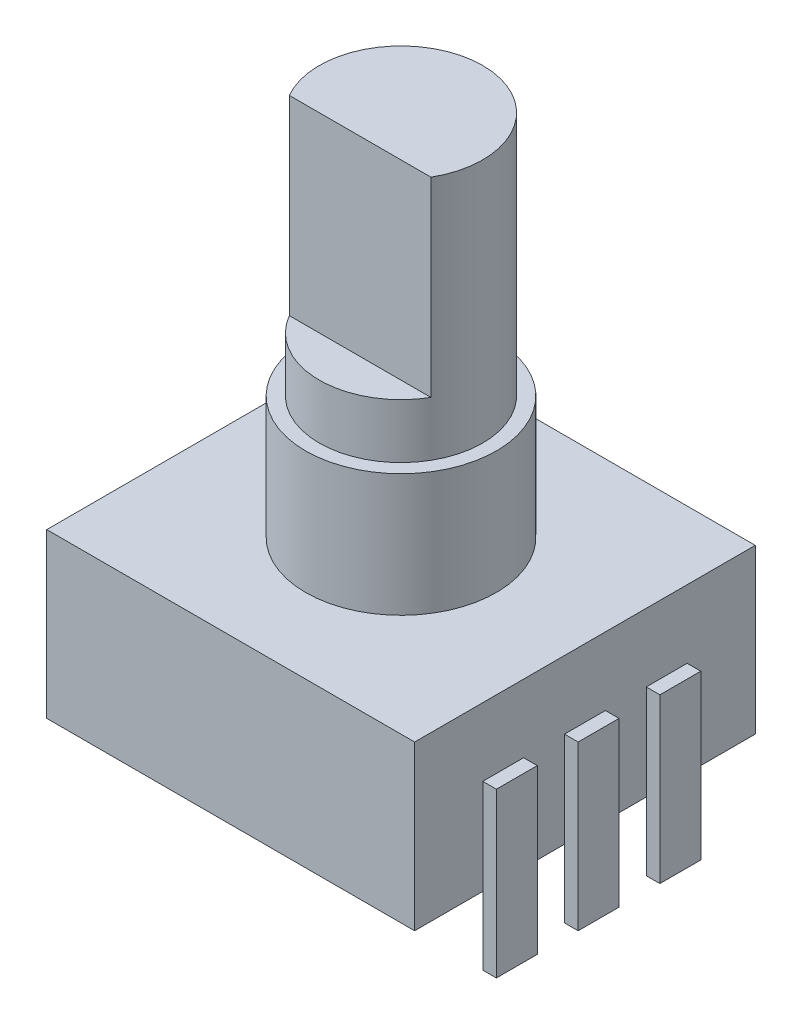
ISO-10303-21;
HEADER;
FILE_DESCRIPTION(('STEP AP214'),'2;1');
FILE_NAME('part.step','',(''),(''),'','','');
FILE_SCHEMA(('AUTOMOTIVE_DESIGN { 1 0 10303 214 1 1 1 1 }'));
ENDSEC;
DATA;
#1=APPLICATION_CONTEXT('core data for automotive mechanical design processes');
#2=APPLICATION_PROTOCOL_DEFINITION('international standard','automotive_design',2000,#1);
#3=PRODUCT_CONTEXT('',#1,'mechanical');
#4=PRODUCT('Part','Part','',(#3));
#5=PRODUCT_RELATED_PRODUCT_CATEGORY('part','',(#4));
#6=PRODUCT_DEFINITION_FORMATION('','',#4);
#7=PRODUCT_DEFINITION_CONTEXT('part definition',#1,'design');
#8=PRODUCT_DEFINITION('design','',#6,#7);
#9=PRODUCT_DEFINITION_SHAPE('','',#8);
#10=(LENGTH_UNIT() NAMED_UNIT(*) SI_UNIT(.MILLI.,.METRE.));
#11=(NAMED_UNIT(*) PLANE_ANGLE_UNIT() SI_UNIT($,.RADIAN.));
#12=(NAMED_UNIT(*) SI_UNIT($,.STERADIAN.) SOLID_ANGLE_UNIT());
#13=UNCERTAINTY_MEASURE_WITH_UNIT(LENGTH_MEASURE(1.E-05),#10,'distance_accuracy_value','');
#14=(GEOMETRIC_REPRESENTATION_CONTEXT(3) GLOBAL_UNCERTAINTY_ASSIGNED_CONTEXT((#13)) GLOBAL_UNIT_ASSIGNED_CONTEXT((#10,
#11,#12)) REPRESENTATION_CONTEXT('',''));
#15=CARTESIAN_POINT('',(0.,0.,0.));
#16=DIRECTION('',(0.,0.,1.));
#17=DIRECTION('',(1.,0.,0.));
#18=AXIS2_PLACEMENT_3D('',#15,#16,#17);
#19=CARTESIAN_POINT('',(6.75,-6.,0.));
#20=DIRECTION('',(-1.,0.,0.));
#21=DIRECTION('',(0.,0.,1.));
#22=AXIS2_PLACEMENT_3D('',#19,#20,#21);
#23=PLANE('',#22);
#24=DIRECTION('',(0.,0.,1.));
#25=VECTOR('',#24,1.);
#26=CARTESIAN_POINT('',(6.75,-2.5,2.25));
#27=LINE('',#26,#25);
#28=CARTESIAN_POINT('',(6.75,-2.5,2.25));
#29=VERTEX_POINT('',#28);
#30=CARTESIAN_POINT('',(6.75,-2.5,3.75));
#31=VERTEX_POINT('',#30);
#32=EDGE_CURVE('E304',#29,#31,#27,.T.);
#33=ORIENTED_EDGE('',*,*,#32,.F.);
#34=DIRECTION('',(0.,1.,0.));
#35=VECTOR('',#34,1.);
#36=CARTESIAN_POINT('',(6.75,-8.5,2.25));
#37=LINE('',#36,#35);
#38=CARTESIAN_POINT('',(6.75,-6.,2.25));
#39=VERTEX_POINT('',#38);
#40=EDGE_CURVE('E339',#39,#29,#37,.T.);
#41=ORIENTED_EDGE('',*,*,#40,.F.);
#42=DIRECTION('',(0.,0.,1.));
#43=VECTOR('',#42,1.);
#44=CARTESIAN_POINT('',(6.75,-6.,0.));
#45=LINE('',#44,#43);
#46=CARTESIAN_POINT('',(6.75,-6.,0.75));
#47=VERTEX_POINT('',#46);
#48=EDGE_CURVE('E480',#47,#39,#45,.T.);
#49=ORIENTED_EDGE('',*,*,#48,.F.);
#50=DIRECTION('',(0.,1.,0.));
#51=VECTOR('',#50,1.);
#52=CARTESIAN_POINT('',(6.75,-8.5,0.75));
#53=LINE('',#52,#51);
#54=CARTESIAN_POINT('',(6.75,-2.5,0.75));
#55=VERTEX_POINT('',#54);
#56=EDGE_CURVE('E359',#47,#55,#53,.T.);
#57=ORIENTED_EDGE('',*,*,#56,.T.);
#58=DIRECTION('',(0.,0.,1.));
#59=VECTOR('',#58,1.);
#60=CARTESIAN_POINT('',(6.75,-2.5,-0.75));
#61=LINE('',#60,#59);
#62=CARTESIAN_POINT('',(6.75,-2.5,-0.75));
#63=VERTEX_POINT('',#62);
#64=EDGE_CURVE('E338',#63,#55,#61,.T.);
#65=ORIENTED_EDGE('',*,*,#64,.F.);
#66=DIRECTION('',(0.,1.,0.));
#67=VECTOR('',#66,1.);
#68=CARTESIAN_POINT('',(6.75,-8.5,-0.75));
#69=LINE('',#68,#67);
#70=CARTESIAN_POINT('',(6.75,-6.,-0.75));
#71=VERTEX_POINT('',#70);
#72=EDGE_CURVE('E374',#71,#63,#69,.T.);
#73=ORIENTED_EDGE('',*,*,#72,.F.);
#74=CARTESIAN_POINT('',(6.75,-6.,-2.25));
#75=VERTEX_POINT('',#74);
#76=EDGE_CURVE('E483',#75,#71,#45,.T.);
#77=ORIENTED_EDGE('',*,*,#76,.F.);
#78=DIRECTION('',(0.,1.,0.));
#79=VECTOR('',#78,1.);
#80=CARTESIAN_POINT('',(6.75,-8.5,-2.25));
#81=LINE('',#80,#79);
#82=CARTESIAN_POINT('',(6.75,-2.5,-2.25));
#83=VERTEX_POINT('',#82);
#84=EDGE_CURVE('E415',#75,#83,#81,.T.);
#85=ORIENTED_EDGE('',*,*,#84,.T.);
#86=DIRECTION('',(0.,0.,1.));
#87=VECTOR('',#86,1.);
#88=CARTESIAN_POINT('',(6.75,-2.5,-3.75));
#89=LINE('',#88,#87);
#90=CARTESIAN_POINT('',(6.75,-2.5,-3.75));
#91=VERTEX_POINT('',#90);
#92=EDGE_CURVE('E373',#91,#83,#89,.T.);
#93=ORIENTED_EDGE('',*,*,#92,.F.);
#94=DIRECTION('',(0.,1.,0.));
#95=VECTOR('',#94,1.);
#96=CARTESIAN_POINT('',(6.75,-8.5,-3.75));
#97=LINE('',#96,#95);
#98=CARTESIAN_POINT('',(6.75,-6.,-3.75));
#99=VERTEX_POINT('',#98);
#100=EDGE_CURVE('E409',#99,#91,#97,.T.);
#101=ORIENTED_EDGE('',*,*,#100,.F.);
#102=CARTESIAN_POINT('',(6.75,-6.,-6.25));
#103=VERTEX_POINT('',#102);
#104=EDGE_CURVE('E421',#103,#99,#45,.T.);
#105=ORIENTED_EDGE('',*,*,#104,.F.);
#106=DIRECTION('',(0.,1.,0.));
#107=VECTOR('',#106,1.);
#108=CARTESIAN_POINT('',(6.75,-6.,-6.25));
#109=LINE('',#108,#107);
#110=CARTESIAN_POINT('',(6.75,0.,-6.25));
#111=VERTEX_POINT('',#110);
#112=EDGE_CURVE('E47',#103,#111,#109,.T.);
#113=ORIENTED_EDGE('',*,*,#112,.T.);
#114=DIRECTION('',(0.,0.,1.));
#115=VECTOR('',#114,1.);
#116=CARTESIAN_POINT('',(6.75,0.,0.));
#117=LINE('',#116,#115);
#118=CARTESIAN_POINT('',(6.75,0.,6.25));
#119=VERTEX_POINT('',#118);
#120=EDGE_CURVE('E437',#111,#119,#117,.T.);
#121=ORIENTED_EDGE('',*,*,#120,.T.);
#122=DIRECTION('',(0.,1.,0.));
#123=VECTOR('',#122,1.);
#124=CARTESIAN_POINT('',(6.75,-6.,6.25));
#125=LINE('',#124,#123);
#126=CARTESIAN_POINT('',(6.75,-6.,6.25));
#127=VERTEX_POINT('',#126);
#128=EDGE_CURVE('E447',#127,#119,#125,.T.);
#129=ORIENTED_EDGE('',*,*,#128,.F.);
#130=CARTESIAN_POINT('',(6.75,-6.,3.75));
#131=VERTEX_POINT('',#130);
#132=EDGE_CURVE('E419',#131,#127,#45,.T.);
#133=ORIENTED_EDGE('',*,*,#132,.F.);
#134=DIRECTION('',(0.,1.,0.));
#135=VECTOR('',#134,1.);
#136=CARTESIAN_POINT('',(6.75,-8.5,3.75));
#137=LINE('',#136,#135);
#138=EDGE_CURVE('E324',#131,#31,#137,.T.);
#139=ORIENTED_EDGE('',*,*,#138,.T.);
#140=EDGE_LOOP('',(#33,#41,#49,#57,#65,#73,#77,#85,#93,#101,#105,#113,#121,#129,#133,#139));
#141=FACE_BOUND('',#140,.T.);
#142=ADVANCED_FACE('F43',(#141),#23,.F.);
#143=CARTESIAN_POINT('',(0.,-6.,6.25));
#144=DIRECTION('',(0.,0.,1.));
#145=DIRECTION('',(1.,0.,0.));
#146=AXIS2_PLACEMENT_3D('',#143,#144,#145);
#147=PLANE('',#146);
#148=DIRECTION('',(1.,0.,0.));
#149=VECTOR('',#148,1.);
#150=CARTESIAN_POINT('',(0.,0.,6.25));
#151=LINE('',#150,#149);
#152=CARTESIAN_POINT('',(-6.75,0.,6.25));
#153=VERTEX_POINT('',#152);
#154=EDGE_CURVE('E420',#153,#119,#151,.T.);
#155=ORIENTED_EDGE('',*,*,#154,.F.);
#156=DIRECTION('',(0.,1.,0.));
#157=VECTOR('',#156,1.);
#158=CARTESIAN_POINT('',(-6.75,-6.,6.25));
#159=LINE('',#158,#157);
#160=CARTESIAN_POINT('',(-6.75,-6.,6.25));
#161=VERTEX_POINT('',#160);
#162=EDGE_CURVE('E449',#161,#153,#159,.T.);
#163=ORIENTED_EDGE('',*,*,#162,.F.);
#164=DIRECTION('',(1.,0.,0.));
#165=VECTOR('',#164,1.);
#166=CARTESIAN_POINT('',(0.,-6.,6.25));
#167=LINE('',#166,#165);
#168=EDGE_CURVE('E431',#161,#127,#167,.T.);
#169=ORIENTED_EDGE('',*,*,#168,.T.);
#170=ORIENTED_EDGE('',*,*,#128,.T.);
#171=EDGE_LOOP('',(#155,#163,#169,#170));
#172=FACE_BOUND('',#171,.T.);
#173=ADVANCED_FACE('F468',(#172),#147,.T.);
#174=CARTESIAN_POINT('',(-6.75,-6.,0.));
#175=DIRECTION('',(-1.,0.,0.));
#176=DIRECTION('',(0.,0.,1.));
#177=AXIS2_PLACEMENT_3D('',#174,#175,#176);
#178=PLANE('',#177);
#179=DIRECTION('',(0.,1.,0.));
#180=VECTOR('',#179,1.);
#181=CARTESIAN_POINT('',(-6.75,-8.5,3.5));
#182=LINE('',#181,#180);
#183=CARTESIAN_POINT('',(-6.75,-6.,3.5));
#184=VERTEX_POINT('',#183);
#185=CARTESIAN_POINT('',(-6.75,-2.5,3.5));
#186=VERTEX_POINT('',#185);
#187=EDGE_CURVE('E276',#184,#186,#182,.T.);
#188=ORIENTED_EDGE('',*,*,#187,.F.);
#189=DIRECTION('',(0.,0.,1.));
#190=VECTOR('',#189,1.);
#191=CARTESIAN_POINT('',(-6.75,-6.,0.));
#192=LINE('',#191,#190);
#193=EDGE_CURVE('E427',#184,#161,#192,.T.);
#194=ORIENTED_EDGE('',*,*,#193,.T.);
#195=ORIENTED_EDGE('',*,*,#162,.T.);
#196=DIRECTION('',(0.,0.,1.));
#197=VECTOR('',#196,1.);
#198=CARTESIAN_POINT('',(-6.75,0.,0.));
#199=LINE('',#198,#197);
#200=CARTESIAN_POINT('',(-6.75,0.,-6.25));
#201=VERTEX_POINT('',#200);
#202=EDGE_CURVE('E442',#201,#153,#199,.T.);
#203=ORIENTED_EDGE('',*,*,#202,.F.);
#204=DIRECTION('',(0.,1.,0.));
#205=VECTOR('',#204,1.);
#206=CARTESIAN_POINT('',(-6.75,-6.,-6.25));
#207=LINE('',#206,#205);
#208=CARTESIAN_POINT('',(-6.75,-6.,-6.25));
#209=VERTEX_POINT('',#208);
#210=EDGE_CURVE('E450',#209,#201,#207,.T.);
#211=ORIENTED_EDGE('',*,*,#210,.F.);
#212=CARTESIAN_POINT('',(-6.75,-6.,-3.5));
#213=VERTEX_POINT('',#212);
#214=EDGE_CURVE('E428',#209,#213,#192,.T.);
#215=ORIENTED_EDGE('',*,*,#214,.T.);
#216=DIRECTION('',(0.,1.,0.));
#217=VECTOR('',#216,1.);
#218=CARTESIAN_POINT('',(-6.75,-8.5,-3.5));
#219=LINE('',#218,#217);
#220=CARTESIAN_POINT('',(-6.75,-2.5,-3.5));
#221=VERTEX_POINT('',#220);
#222=EDGE_CURVE('E52',#213,#221,#219,.T.);
#223=ORIENTED_EDGE('',*,*,#222,.T.);
#224=DIRECTION('',(0.,0.,-1.));
#225=VECTOR('',#224,1.);
#226=CARTESIAN_POINT('',(-6.75,-2.5,-3.5));
#227=LINE('',#226,#225);
#228=CARTESIAN_POINT('',(-6.75,-2.5,-2.));
#229=VERTEX_POINT('',#228);
#230=EDGE_CURVE('E275',#229,#221,#227,.T.);
#231=ORIENTED_EDGE('',*,*,#230,.F.);
#232=DIRECTION('',(0.,1.,0.));
#233=VECTOR('',#232,1.);
#234=CARTESIAN_POINT('',(-6.75,-8.5,-2.));
#235=LINE('',#234,#233);
#236=CARTESIAN_POINT('',(-6.75,-6.,-2.));
#237=VERTEX_POINT('',#236);
#238=EDGE_CURVE('E12',#237,#229,#235,.T.);
#239=ORIENTED_EDGE('',*,*,#238,.F.);
#240=CARTESIAN_POINT('',(-6.75,-6.,2.));
#241=VERTEX_POINT('',#240);
#242=EDGE_CURVE('E804',#237,#241,#192,.T.);
#243=ORIENTED_EDGE('',*,*,#242,.T.);
#244=DIRECTION('',(0.,1.,0.));
#245=VECTOR('',#244,1.);
#246=CARTESIAN_POINT('',(-6.75,-8.5,2.));
#247=LINE('',#246,#245);
#248=CARTESIAN_POINT('',(-6.75,-2.5,2.));
#249=VERTEX_POINT('',#248);
#250=EDGE_CURVE('E61',#241,#249,#247,.T.);
#251=ORIENTED_EDGE('',*,*,#250,.T.);
#252=DIRECTION('',(0.,0.,-1.));
#253=VECTOR('',#252,1.);
#254=CARTESIAN_POINT('',(-6.75,-2.5,3.5));
#255=LINE('',#254,#253);
#256=EDGE_CURVE('E66',#186,#249,#255,.T.);
#257=ORIENTED_EDGE('',*,*,#256,.F.);
#258=EDGE_LOOP('',(#188,#194,#195,#203,#211,#215,#223,#231,#239,#243,#251,#257));
#259=FACE_BOUND('',#258,.T.);
#260=ADVANCED_FACE('F524',(#259),#178,.T.);
#261=CARTESIAN_POINT('',(0.,-6.,0.));
#262=DIRECTION('',(0.,1.,0.));
#263=DIRECTION('',(0.,0.,1.));
#264=AXIS2_PLACEMENT_3D('',#261,#262,#263);
#265=CYLINDRICAL_SURFACE('',#264,3.5);
#266=CARTESIAN_POINT('',(0.,-6.,0.));
#267=DIRECTION('',(0.,1.,0.));
#268=DIRECTION('',(0.,0.,1.));
#269=AXIS2_PLACEMENT_3D('',#266,#267,#268);
#270=CIRCLE('',#269,3.5);
#271=CARTESIAN_POINT('',(0.,-6.,3.5));
#272=VERTEX_POINT('',#271);
#273=EDGE_CURVE('E416',#272,#272,#270,.T.);
#274=ORIENTED_EDGE('',*,*,#273,.F.);
#275=EDGE_LOOP('',(#274));
#276=FACE_BOUND('',#275,.T.);
#277=CARTESIAN_POINT('',(0.,0.,0.));
#278=DIRECTION('',(0.,1.,0.));
#279=DIRECTION('',(0.,0.,1.));
#280=AXIS2_PLACEMENT_3D('',#277,#278,#279);
#281=CIRCLE('',#280,3.5);
#282=CARTESIAN_POINT('',(0.,0.,3.5));
#283=VERTEX_POINT('',#282);
#284=EDGE_CURVE('E407',#283,#283,#281,.T.);
#285=ORIENTED_EDGE('',*,*,#284,.T.);
#286=EDGE_LOOP('',(#285));
#287=FACE_BOUND('',#286,.T.);
#288=ADVANCED_FACE('F45',(#276,#287),#265,.F.);
#289=CARTESIAN_POINT('',(0.,-6.,-6.25));
#290=DIRECTION('',(0.,0.,1.));
#291=DIRECTION('',(1.,0.,0.));
#292=AXIS2_PLACEMENT_3D('',#289,#290,#291);
#293=PLANE('',#292);
#294=DIRECTION('',(1.,0.,0.));
#295=VECTOR('',#294,1.);
#296=CARTESIAN_POINT('',(0.,0.,-6.25));
#297=LINE('',#296,#295);
#298=EDGE_CURVE('E440',#201,#111,#297,.T.);
#299=ORIENTED_EDGE('',*,*,#298,.T.);
#300=ORIENTED_EDGE('',*,*,#112,.F.);
#301=DIRECTION('',(1.,0.,0.));
#302=VECTOR('',#301,1.);
#303=CARTESIAN_POINT('',(0.,-6.,-6.25));
#304=LINE('',#303,#302);
#305=EDGE_CURVE('E424',#209,#103,#304,.T.);
#306=ORIENTED_EDGE('',*,*,#305,.F.);
#307=ORIENTED_EDGE('',*,*,#210,.T.);
#308=EDGE_LOOP('',(#299,#300,#306,#307));
#309=FACE_BOUND('',#308,.T.);
#310=ADVANCED_FACE('F527',(#309),#293,.F.);
#311=CARTESIAN_POINT('',(0.,-6.,0.));
#312=DIRECTION('',(0.,1.,0.));
#313=DIRECTION('',(0.,0.,1.));
#314=AXIS2_PLACEMENT_3D('',#311,#312,#313);
#315=PLANE('',#314);
#316=ORIENTED_EDGE('',*,*,#273,.T.);
#317=EDGE_LOOP('',(#316));
#318=FACE_BOUND('',#317,.T.);
#319=ORIENTED_EDGE('',*,*,#104,.T.);
#320=EDGE_CURVE('E425',#99,#75,#45,.T.);
#321=ORIENTED_EDGE('',*,*,#320,.T.);
#322=ORIENTED_EDGE('',*,*,#76,.T.);
#323=EDGE_CURVE('E482',#71,#47,#45,.T.);
#324=ORIENTED_EDGE('',*,*,#323,.T.);
#325=ORIENTED_EDGE('',*,*,#48,.T.);
#326=EDGE_CURVE('E475',#39,#131,#45,.T.);
#327=ORIENTED_EDGE('',*,*,#326,.T.);
#328=ORIENTED_EDGE('',*,*,#132,.T.);
#329=ORIENTED_EDGE('',*,*,#168,.F.);
#330=ORIENTED_EDGE('',*,*,#193,.F.);
#331=EDGE_CURVE('E802',#241,#184,#192,.T.);
#332=ORIENTED_EDGE('',*,*,#331,.F.);
#333=ORIENTED_EDGE('',*,*,#242,.F.);
#334=EDGE_CURVE('E432',#213,#237,#192,.T.);
#335=ORIENTED_EDGE('',*,*,#334,.F.);
#336=ORIENTED_EDGE('',*,*,#214,.F.);
#337=ORIENTED_EDGE('',*,*,#305,.T.);
#338=EDGE_LOOP('',(#319,#321,#322,#324,#325,#327,#328,#329,#330,#332,#333,#335,#336,#337));
#339=FACE_BOUND('',#338,.T.);
#340=ADVANCED_FACE('F477',(#318,#339),#315,.F.);
#341=CARTESIAN_POINT('',(0.,0.,0.));
#342=DIRECTION('',(0.,1.,0.));
#343=DIRECTION('',(0.,0.,1.));
#344=AXIS2_PLACEMENT_3D('',#341,#342,#343);
#345=PLANE('',#344);
#346=ORIENTED_EDGE('',*,*,#284,.F.);
#347=EDGE_LOOP('',(#346));
#348=FACE_BOUND('',#347,.T.);
#349=ORIENTED_EDGE('',*,*,#120,.F.);
#350=ORIENTED_EDGE('',*,*,#298,.F.);
#351=ORIENTED_EDGE('',*,*,#202,.T.);
#352=ORIENTED_EDGE('',*,*,#154,.T.);
#353=EDGE_LOOP('',(#349,#350,#351,#352));
#354=FACE_BOUND('',#353,.T.);
#355=ADVANCED_FACE('F463',(#348,#354),#345,.T.);
#356=CARTESIAN_POINT('',(6.75,-8.5,-3.75));
#357=DIRECTION('',(-1.,0.,0.));
#358=DIRECTION('',(0.,0.,1.));
#359=AXIS2_PLACEMENT_3D('',#356,#357,#358);
#360=PLANE('',#359);
#361=ORIENTED_EDGE('',*,*,#320,.F.);
#362=CARTESIAN_POINT('',(6.75,-8.5,-3.75));
#363=VERTEX_POINT('',#362);
#364=EDGE_CURVE('E404',#363,#99,#97,.T.);
#365=ORIENTED_EDGE('',*,*,#364,.F.);
#366=DIRECTION('',(0.,0.,1.));
#367=VECTOR('',#366,1.);
#368=CARTESIAN_POINT('',(6.75,-8.5,-3.75));
#369=LINE('',#368,#367);
#370=CARTESIAN_POINT('',(6.75,-8.5,-2.25));
#371=VERTEX_POINT('',#370);
#372=EDGE_CURVE('E381',#363,#371,#369,.T.);
#373=ORIENTED_EDGE('',*,*,#372,.T.);
#374=EDGE_CURVE('E394',#371,#75,#81,.T.);
#375=ORIENTED_EDGE('',*,*,#374,.T.);
#376=EDGE_LOOP('',(#361,#365,#373,#375));
#377=FACE_BOUND('',#376,.T.);
#378=ADVANCED_FACE('F488',(#377),#360,.T.);
#379=CARTESIAN_POINT('',(6.75,-8.5,-3.75));
#380=DIRECTION('',(0.,0.,-1.));
#381=DIRECTION('',(-1.,0.,0.));
#382=AXIS2_PLACEMENT_3D('',#379,#380,#381);
#383=PLANE('',#382);
#384=DIRECTION('',(-1.,0.,0.));
#385=VECTOR('',#384,1.);
#386=CARTESIAN_POINT('',(6.75,-2.5,-3.75));
#387=LINE('',#386,#385);
#388=CARTESIAN_POINT('',(7.25,-2.5,-3.75));
#389=VERTEX_POINT('',#388);
#390=EDGE_CURVE('E385',#389,#91,#387,.T.);
#391=ORIENTED_EDGE('',*,*,#390,.F.);
#392=DIRECTION('',(0.,1.,0.));
#393=VECTOR('',#392,1.);
#394=CARTESIAN_POINT('',(7.25,-8.5,-3.75));
#395=LINE('',#394,#393);
#396=CARTESIAN_POINT('',(7.25,-8.5,-3.75));
#397=VERTEX_POINT('',#396);
#398=EDGE_CURVE('E408',#397,#389,#395,.T.);
#399=ORIENTED_EDGE('',*,*,#398,.F.);
#400=DIRECTION('',(-1.,0.,0.));
#401=VECTOR('',#400,1.);
#402=CARTESIAN_POINT('',(6.75,-8.5,-3.75));
#403=LINE('',#402,#401);
#404=EDGE_CURVE('E391',#397,#363,#403,.T.);
#405=ORIENTED_EDGE('',*,*,#404,.T.);
#406=ORIENTED_EDGE('',*,*,#364,.T.);
#407=ORIENTED_EDGE('',*,*,#100,.T.);
#408=EDGE_LOOP('',(#391,#399,#405,#406,#407));
#409=FACE_BOUND('',#408,.T.);
#410=ADVANCED_FACE('F492',(#409),#383,.T.);
#411=CARTESIAN_POINT('',(7.25,-8.5,-3.75));
#412=DIRECTION('',(1.,0.,0.));
#413=DIRECTION('',(0.,0.,-1.));
#414=AXIS2_PLACEMENT_3D('',#411,#412,#413);
#415=PLANE('',#414);
#416=DIRECTION('',(0.,0.,-1.));
#417=VECTOR('',#416,1.);
#418=CARTESIAN_POINT('',(7.25,-2.5,-3.75));
#419=LINE('',#418,#417);
#420=CARTESIAN_POINT('',(7.25,-2.5,-2.25));
#421=VERTEX_POINT('',#420);
#422=EDGE_CURVE('E399',#421,#389,#419,.T.);
#423=ORIENTED_EDGE('',*,*,#422,.F.);
#424=DIRECTION('',(0.,1.,0.));
#425=VECTOR('',#424,1.);
#426=CARTESIAN_POINT('',(7.25,-8.5,-2.25));
#427=LINE('',#426,#425);
#428=CARTESIAN_POINT('',(7.25,-8.5,-2.25));
#429=VERTEX_POINT('',#428);
#430=EDGE_CURVE('E411',#429,#421,#427,.T.);
#431=ORIENTED_EDGE('',*,*,#430,.F.);
#432=DIRECTION('',(0.,0.,-1.));
#433=VECTOR('',#432,1.);
#434=CARTESIAN_POINT('',(7.25,-8.5,-3.75));
#435=LINE('',#434,#433);
#436=EDGE_CURVE('E388',#429,#397,#435,.T.);
#437=ORIENTED_EDGE('',*,*,#436,.T.);
#438=ORIENTED_EDGE('',*,*,#398,.T.);
#439=EDGE_LOOP('',(#423,#431,#437,#438));
#440=FACE_BOUND('',#439,.T.);
#441=ADVANCED_FACE('F507',(#440),#415,.T.);
#442=CARTESIAN_POINT('',(6.75,-8.5,-2.25));
#443=DIRECTION('',(0.,0.,1.));
#444=DIRECTION('',(1.,0.,0.));
#445=AXIS2_PLACEMENT_3D('',#442,#443,#444);
#446=PLANE('',#445);
#447=DIRECTION('',(1.,0.,0.));
#448=VECTOR('',#447,1.);
#449=CARTESIAN_POINT('',(6.75,-2.5,-2.25));
#450=LINE('',#449,#448);
#451=EDGE_CURVE('E396',#83,#421,#450,.T.);
#452=ORIENTED_EDGE('',*,*,#451,.F.);
#453=ORIENTED_EDGE('',*,*,#84,.F.);
#454=ORIENTED_EDGE('',*,*,#374,.F.);
#455=DIRECTION('',(1.,0.,0.));
#456=VECTOR('',#455,1.);
#457=CARTESIAN_POINT('',(6.75,-8.5,-2.25));
#458=LINE('',#457,#456);
#459=EDGE_CURVE('E384',#371,#429,#458,.T.);
#460=ORIENTED_EDGE('',*,*,#459,.T.);
#461=ORIENTED_EDGE('',*,*,#430,.T.);
#462=EDGE_LOOP('',(#452,#453,#454,#460,#461));
#463=FACE_BOUND('',#462,.T.);
#464=ADVANCED_FACE('F500',(#463),#446,.T.);
#465=CARTESIAN_POINT('',(0.,-8.5,0.));
#466=DIRECTION('',(0.,1.,0.));
#467=DIRECTION('',(0.,0.,1.));
#468=AXIS2_PLACEMENT_3D('',#465,#466,#467);
#469=PLANE('',#468);
#470=ORIENTED_EDGE('',*,*,#372,.F.);
#471=ORIENTED_EDGE('',*,*,#404,.F.);
#472=ORIENTED_EDGE('',*,*,#436,.F.);
#473=ORIENTED_EDGE('',*,*,#459,.F.);
#474=EDGE_LOOP('',(#470,#471,#472,#473));
#475=FACE_BOUND('',#474,.T.);
#476=ADVANCED_FACE('F509',(#475),#469,.F.);
#477=CARTESIAN_POINT('',(0.,-2.5,0.));
#478=DIRECTION('',(0.,1.,0.));
#479=DIRECTION('',(0.,0.,1.));
#480=AXIS2_PLACEMENT_3D('',#477,#478,#479);
#481=PLANE('',#480);
#482=ORIENTED_EDGE('',*,*,#92,.T.);
#483=ORIENTED_EDGE('',*,*,#451,.T.);
#484=ORIENTED_EDGE('',*,*,#422,.T.);
#485=ORIENTED_EDGE('',*,*,#390,.T.);
#486=EDGE_LOOP('',(#482,#483,#484,#485));
#487=FACE_BOUND('',#486,.T.);
#488=ADVANCED_FACE('F504',(#487),#481,.T.);
#489=CARTESIAN_POINT('',(6.75,-8.5,-0.75));
#490=DIRECTION('',(-1.,0.,0.));
#491=DIRECTION('',(0.,0.,1.));
#492=AXIS2_PLACEMENT_3D('',#489,#490,#491);
#493=PLANE('',#492);
#494=ORIENTED_EDGE('',*,*,#323,.F.);
#495=CARTESIAN_POINT('',(6.75,-8.5,-0.75));
#496=VERTEX_POINT('',#495);
#497=EDGE_CURVE('E370',#496,#71,#69,.T.);
#498=ORIENTED_EDGE('',*,*,#497,.F.);
#499=DIRECTION('',(0.,0.,1.));
#500=VECTOR('',#499,1.);
#501=CARTESIAN_POINT('',(6.75,-8.5,-0.75));
#502=LINE('',#501,#500);
#503=CARTESIAN_POINT('',(6.75,-8.5,0.75));
#504=VERTEX_POINT('',#503);
#505=EDGE_CURVE('E346',#496,#504,#502,.T.);
#506=ORIENTED_EDGE('',*,*,#505,.T.);
#507=EDGE_CURVE('E379',#504,#47,#53,.T.);
#508=ORIENTED_EDGE('',*,*,#507,.T.);
#509=EDGE_LOOP('',(#494,#498,#506,#508));
#510=FACE_BOUND('',#509,.T.);
#511=ADVANCED_FACE('F516',(#510),#493,.T.);
#512=CARTESIAN_POINT('',(6.75,-8.5,-0.75));
#513=DIRECTION('',(0.,0.,-1.));
#514=DIRECTION('',(-1.,0.,0.));
#515=AXIS2_PLACEMENT_3D('',#512,#513,#514);
#516=PLANE('',#515);
#517=DIRECTION('',(-1.,0.,0.));
#518=VECTOR('',#517,1.);
#519=CARTESIAN_POINT('',(6.75,-2.5,-0.75));
#520=LINE('',#519,#518);
#521=CARTESIAN_POINT('',(7.25,-2.5,-0.75));
#522=VERTEX_POINT('',#521);
#523=EDGE_CURVE('E350',#522,#63,#520,.T.);
#524=ORIENTED_EDGE('',*,*,#523,.F.);
#525=DIRECTION('',(0.,1.,0.));
#526=VECTOR('',#525,1.);
#527=CARTESIAN_POINT('',(7.25,-8.5,-0.75));
#528=LINE('',#527,#526);
#529=CARTESIAN_POINT('',(7.25,-8.5,-0.75));
#530=VERTEX_POINT('',#529);
#531=EDGE_CURVE('E375',#530,#522,#528,.T.);
#532=ORIENTED_EDGE('',*,*,#531,.F.);
#533=DIRECTION('',(-1.,0.,0.));
#534=VECTOR('',#533,1.);
#535=CARTESIAN_POINT('',(6.75,-8.5,-0.75));
#536=LINE('',#535,#534);
#537=EDGE_CURVE('E356',#530,#496,#536,.T.);
#538=ORIENTED_EDGE('',*,*,#537,.T.);
#539=ORIENTED_EDGE('',*,*,#497,.T.);
#540=ORIENTED_EDGE('',*,*,#72,.T.);
#541=EDGE_LOOP('',(#524,#532,#538,#539,#540));
#542=FACE_BOUND('',#541,.T.);
#543=ADVANCED_FACE('F574',(#542),#516,.T.);
#544=CARTESIAN_POINT('',(7.25,-8.5,-0.75));
#545=DIRECTION('',(1.,0.,0.));
#546=DIRECTION('',(0.,0.,-1.));
#547=AXIS2_PLACEMENT_3D('',#544,#545,#546);
#548=PLANE('',#547);
#549=DIRECTION('',(0.,0.,-1.));
#550=VECTOR('',#549,1.);
#551=CARTESIAN_POINT('',(7.25,-2.5,-0.75));
#552=LINE('',#551,#550);
#553=CARTESIAN_POINT('',(7.25,-2.5,0.75));
#554=VERTEX_POINT('',#553);
#555=EDGE_CURVE('E365',#554,#522,#552,.T.);
#556=ORIENTED_EDGE('',*,*,#555,.F.);
#557=DIRECTION('',(0.,1.,0.));
#558=VECTOR('',#557,1.);
#559=CARTESIAN_POINT('',(7.25,-8.5,0.75));
#560=LINE('',#559,#558);
#561=CARTESIAN_POINT('',(7.25,-8.5,0.75));
#562=VERTEX_POINT('',#561);
#563=EDGE_CURVE('E377',#562,#554,#560,.T.);
#564=ORIENTED_EDGE('',*,*,#563,.F.);
#565=DIRECTION('',(0.,0.,-1.));
#566=VECTOR('',#565,1.);
#567=CARTESIAN_POINT('',(7.25,-8.5,-0.75));
#568=LINE('',#567,#566);
#569=EDGE_CURVE('E353',#562,#530,#568,.T.);
#570=ORIENTED_EDGE('',*,*,#569,.T.);
#571=ORIENTED_EDGE('',*,*,#531,.T.);
#572=EDGE_LOOP('',(#556,#564,#570,#571));
#573=FACE_BOUND('',#572,.T.);
#574=ADVANCED_FACE('F583',(#573),#548,.T.);
#575=CARTESIAN_POINT('',(6.75,-8.5,0.75));
#576=DIRECTION('',(0.,0.,1.));
#577=DIRECTION('',(1.,0.,0.));
#578=AXIS2_PLACEMENT_3D('',#575,#576,#577);
#579=PLANE('',#578);
#580=DIRECTION('',(1.,0.,0.));
#581=VECTOR('',#580,1.);
#582=CARTESIAN_POINT('',(6.75,-2.5,0.75));
#583=LINE('',#582,#581);
#584=EDGE_CURVE('E362',#55,#554,#583,.T.);
#585=ORIENTED_EDGE('',*,*,#584,.F.);
#586=ORIENTED_EDGE('',*,*,#56,.F.);
#587=ORIENTED_EDGE('',*,*,#507,.F.);
#588=DIRECTION('',(1.,0.,0.));
#589=VECTOR('',#588,1.);
#590=CARTESIAN_POINT('',(6.75,-8.5,0.75));
#591=LINE('',#590,#589);
#592=EDGE_CURVE('E349',#504,#562,#591,.T.);
#593=ORIENTED_EDGE('',*,*,#592,.T.);
#594=ORIENTED_EDGE('',*,*,#563,.T.);
#595=EDGE_LOOP('',(#585,#586,#587,#593,#594));
#596=FACE_BOUND('',#595,.T.);
#597=ADVANCED_FACE('F593',(#596),#579,.T.);
#598=CARTESIAN_POINT('',(0.,-8.5,0.));
#599=DIRECTION('',(0.,1.,0.));
#600=DIRECTION('',(0.,0.,1.));
#601=AXIS2_PLACEMENT_3D('',#598,#599,#600);
#602=PLANE('',#601);
#603=ORIENTED_EDGE('',*,*,#505,.F.);
#604=ORIENTED_EDGE('',*,*,#537,.F.);
#605=ORIENTED_EDGE('',*,*,#569,.F.);
#606=ORIENTED_EDGE('',*,*,#592,.F.);
#607=EDGE_LOOP('',(#603,#604,#605,#606));
#608=FACE_BOUND('',#607,.T.);
#609=ADVANCED_FACE('F603',(#608),#602,.F.);
#610=CARTESIAN_POINT('',(0.,-2.5,0.));
#611=DIRECTION('',(0.,1.,0.));
#612=DIRECTION('',(0.,0.,1.));
#613=AXIS2_PLACEMENT_3D('',#610,#611,#612);
#614=PLANE('',#613);
#615=ORIENTED_EDGE('',*,*,#64,.T.);
#616=ORIENTED_EDGE('',*,*,#584,.T.);
#617=ORIENTED_EDGE('',*,*,#555,.T.);
#618=ORIENTED_EDGE('',*,*,#523,.T.);
#619=EDGE_LOOP('',(#615,#616,#617,#618));
#620=FACE_BOUND('',#619,.T.);
#621=ADVANCED_FACE('F613',(#620),#614,.T.);
#622=CARTESIAN_POINT('',(6.75,-8.5,2.25));
#623=DIRECTION('',(-1.,0.,0.));
#624=DIRECTION('',(0.,0.,1.));
#625=AXIS2_PLACEMENT_3D('',#622,#623,#624);
#626=PLANE('',#625);
#627=ORIENTED_EDGE('',*,*,#326,.F.);
#628=CARTESIAN_POINT('',(6.75,-8.5,2.25));
#629=VERTEX_POINT('',#628);
#630=EDGE_CURVE('E335',#629,#39,#37,.T.);
#631=ORIENTED_EDGE('',*,*,#630,.F.);
#632=DIRECTION('',(0.,0.,1.));
#633=VECTOR('',#632,1.);
#634=CARTESIAN_POINT('',(6.75,-8.5,2.25));
#635=LINE('',#634,#633);
#636=CARTESIAN_POINT('',(6.75,-8.5,3.75));
#637=VERTEX_POINT('',#636);
#638=EDGE_CURVE('E311',#629,#637,#635,.T.);
#639=ORIENTED_EDGE('',*,*,#638,.T.);
#640=EDGE_CURVE('E344',#637,#131,#137,.T.);
#641=ORIENTED_EDGE('',*,*,#640,.T.);
#642=EDGE_LOOP('',(#627,#631,#639,#641));
#643=FACE_BOUND('',#642,.T.);
#644=ADVANCED_FACE('F623',(#643),#626,.T.);
#645=CARTESIAN_POINT('',(6.75,-8.5,2.25));
#646=DIRECTION('',(0.,0.,-1.));
#647=DIRECTION('',(-1.,0.,0.));
#648=AXIS2_PLACEMENT_3D('',#645,#646,#647);
#649=PLANE('',#648);
#650=DIRECTION('',(-1.,0.,0.));
#651=VECTOR('',#650,1.);
#652=CARTESIAN_POINT('',(6.75,-2.5,2.25));
#653=LINE('',#652,#651);
#654=CARTESIAN_POINT('',(7.25,-2.5,2.25));
#655=VERTEX_POINT('',#654);
#656=EDGE_CURVE('E315',#655,#29,#653,.T.);
#657=ORIENTED_EDGE('',*,*,#656,.F.);
#658=DIRECTION('',(0.,1.,0.));
#659=VECTOR('',#658,1.);
#660=CARTESIAN_POINT('',(7.25,-8.5,2.25));
#661=LINE('',#660,#659);
#662=CARTESIAN_POINT('',(7.25,-8.5,2.25));
#663=VERTEX_POINT('',#662);
#664=EDGE_CURVE('E340',#663,#655,#661,.T.);
#665=ORIENTED_EDGE('',*,*,#664,.F.);
#666=DIRECTION('',(-1.,0.,0.));
#667=VECTOR('',#666,1.);
#668=CARTESIAN_POINT('',(6.75,-8.5,2.25));
#669=LINE('',#668,#667);
#670=EDGE_CURVE('E321',#663,#629,#669,.T.);
#671=ORIENTED_EDGE('',*,*,#670,.T.);
#672=ORIENTED_EDGE('',*,*,#630,.T.);
#673=ORIENTED_EDGE('',*,*,#40,.T.);
#674=EDGE_LOOP('',(#657,#665,#671,#672,#673));
#675=FACE_BOUND('',#674,.T.);
#676=ADVANCED_FACE('F633',(#675),#649,.T.);
#677=CARTESIAN_POINT('',(7.25,-8.5,2.25));
#678=DIRECTION('',(1.,0.,0.));
#679=DIRECTION('',(0.,0.,-1.));
#680=AXIS2_PLACEMENT_3D('',#677,#678,#679);
#681=PLANE('',#680);
#682=DIRECTION('',(0.,0.,-1.));
#683=VECTOR('',#682,1.);
#684=CARTESIAN_POINT('',(7.25,-2.5,2.25));
#685=LINE('',#684,#683);
#686=CARTESIAN_POINT('',(7.25,-2.5,3.75));
#687=VERTEX_POINT('',#686);
#688=EDGE_CURVE('E330',#687,#655,#685,.T.);
#689=ORIENTED_EDGE('',*,*,#688,.F.);
#690=DIRECTION('',(0.,1.,0.));
#691=VECTOR('',#690,1.);
#692=CARTESIAN_POINT('',(7.25,-8.5,3.75));
#693=LINE('',#692,#691);
#694=CARTESIAN_POINT('',(7.25,-8.5,3.75));
#695=VERTEX_POINT('',#694);
#696=EDGE_CURVE('E342',#695,#687,#693,.T.);
#697=ORIENTED_EDGE('',*,*,#696,.F.);
#698=DIRECTION('',(0.,0.,-1.));
#699=VECTOR('',#698,1.);
#700=CARTESIAN_POINT('',(7.25,-8.5,2.25));
#701=LINE('',#700,#699);
#702=EDGE_CURVE('E318',#695,#663,#701,.T.);
#703=ORIENTED_EDGE('',*,*,#702,.T.);
#704=ORIENTED_EDGE('',*,*,#664,.T.);
#705=EDGE_LOOP('',(#689,#697,#703,#704));
#706=FACE_BOUND('',#705,.T.);
#707=ADVANCED_FACE('F642',(#706),#681,.T.);
#708=CARTESIAN_POINT('',(6.75,-8.5,3.75));
#709=DIRECTION('',(0.,0.,1.));
#710=DIRECTION('',(1.,0.,0.));
#711=AXIS2_PLACEMENT_3D('',#708,#709,#710);
#712=PLANE('',#711);
#713=DIRECTION('',(1.,0.,0.));
#714=VECTOR('',#713,1.);
#715=CARTESIAN_POINT('',(6.75,-2.5,3.75));
#716=LINE('',#715,#714);
#717=EDGE_CURVE('E327',#31,#687,#716,.T.);
#718=ORIENTED_EDGE('',*,*,#717,.F.);
#719=ORIENTED_EDGE('',*,*,#138,.F.);
#720=ORIENTED_EDGE('',*,*,#640,.F.);
#721=DIRECTION('',(1.,0.,0.));
#722=VECTOR('',#721,1.);
#723=CARTESIAN_POINT('',(6.75,-8.5,3.75));
#724=LINE('',#723,#722);
#725=EDGE_CURVE('E314',#637,#695,#724,.T.);
#726=ORIENTED_EDGE('',*,*,#725,.T.);
#727=ORIENTED_EDGE('',*,*,#696,.T.);
#728=EDGE_LOOP('',(#718,#719,#720,#726,#727));
#729=FACE_BOUND('',#728,.T.);
#730=ADVANCED_FACE('F652',(#729),#712,.T.);
#731=CARTESIAN_POINT('',(0.,-8.5,0.));
#732=DIRECTION('',(0.,1.,0.));
#733=DIRECTION('',(0.,0.,1.));
#734=AXIS2_PLACEMENT_3D('',#731,#732,#733);
#735=PLANE('',#734);
#736=ORIENTED_EDGE('',*,*,#638,.F.);
#737=ORIENTED_EDGE('',*,*,#670,.F.);
#738=ORIENTED_EDGE('',*,*,#702,.F.);
#739=ORIENTED_EDGE('',*,*,#725,.F.);
#740=EDGE_LOOP('',(#736,#737,#738,#739));
#741=FACE_BOUND('',#740,.T.);
#742=ADVANCED_FACE('F662',(#741),#735,.F.);
#743=CARTESIAN_POINT('',(0.,-2.5,0.));
#744=DIRECTION('',(0.,1.,0.));
#745=DIRECTION('',(0.,0.,1.));
#746=AXIS2_PLACEMENT_3D('',#743,#744,#745);
#747=PLANE('',#746);
#748=ORIENTED_EDGE('',*,*,#32,.T.);
#749=ORIENTED_EDGE('',*,*,#717,.T.);
#750=ORIENTED_EDGE('',*,*,#688,.T.);
#751=ORIENTED_EDGE('',*,*,#656,.T.);
#752=EDGE_LOOP('',(#748,#749,#750,#751));
#753=FACE_BOUND('',#752,.T.);
#754=ADVANCED_FACE('F672',(#753),#747,.T.);
#755=CARTESIAN_POINT('',(-6.75,-8.5,-3.5));
#756=DIRECTION('',(1.,0.,0.));
#757=DIRECTION('',(0.,0.,-1.));
#758=AXIS2_PLACEMENT_3D('',#755,#756,#757);
#759=PLANE('',#758);
#760=CARTESIAN_POINT('',(-6.75,-8.5,-3.5));
#761=VERTEX_POINT('',#760);
#762=EDGE_CURVE('E293',#761,#213,#219,.T.);
#763=ORIENTED_EDGE('',*,*,#762,.T.);
#764=ORIENTED_EDGE('',*,*,#334,.T.);
#765=CARTESIAN_POINT('',(-6.75,-8.5,-2.));
#766=VERTEX_POINT('',#765);
#767=EDGE_CURVE('E54',#766,#237,#235,.T.);
#768=ORIENTED_EDGE('',*,*,#767,.F.);
#769=DIRECTION('',(0.,0.,-1.));
#770=VECTOR('',#769,1.);
#771=CARTESIAN_POINT('',(-6.75,-8.5,-3.5));
#772=LINE('',#771,#770);
#773=EDGE_CURVE('E280',#766,#761,#772,.T.);
#774=ORIENTED_EDGE('',*,*,#773,.T.);
#775=EDGE_LOOP('',(#763,#764,#768,#774));
#776=FACE_BOUND('',#775,.T.);
#777=ADVANCED_FACE('F682',(#776),#759,.T.);
#778=CARTESIAN_POINT('',(-6.75,-8.5,-2.));
#779=DIRECTION('',(0.,0.,1.));
#780=DIRECTION('',(1.,0.,0.));
#781=AXIS2_PLACEMENT_3D('',#778,#779,#780);
#782=PLANE('',#781);
#783=DIRECTION('',(1.,0.,0.));
#784=VECTOR('',#783,1.);
#785=CARTESIAN_POINT('',(-6.75,-2.5,-2.));
#786=LINE('',#785,#784);
#787=CARTESIAN_POINT('',(-7.25,-2.5,-2.));
#788=VERTEX_POINT('',#787);
#789=EDGE_CURVE('E284',#788,#229,#786,.T.);
#790=ORIENTED_EDGE('',*,*,#789,.F.);
#791=DIRECTION('',(0.,1.,0.));
#792=VECTOR('',#791,1.);
#793=CARTESIAN_POINT('',(-7.25,-8.5,-2.));
#794=LINE('',#793,#792);
#795=CARTESIAN_POINT('',(-7.25,-8.5,-2.));
#796=VERTEX_POINT('',#795);
#797=EDGE_CURVE('E305',#796,#788,#794,.T.);
#798=ORIENTED_EDGE('',*,*,#797,.F.);
#799=DIRECTION('',(1.,0.,0.));
#800=VECTOR('',#799,1.);
#801=CARTESIAN_POINT('',(-6.75,-8.5,-2.));
#802=LINE('',#801,#800);
#803=EDGE_CURVE('E290',#796,#766,#802,.T.);
#804=ORIENTED_EDGE('',*,*,#803,.T.);
#805=ORIENTED_EDGE('',*,*,#767,.T.);
#806=ORIENTED_EDGE('',*,*,#238,.T.);
#807=EDGE_LOOP('',(#790,#798,#804,#805,#806));
#808=FACE_BOUND('',#807,.T.);
#809=ADVANCED_FACE('F692',(#808),#782,.T.);
#810=CARTESIAN_POINT('',(-7.25,-8.5,-3.5));
#811=DIRECTION('',(-1.,0.,0.));
#812=DIRECTION('',(0.,0.,1.));
#813=AXIS2_PLACEMENT_3D('',#810,#811,#812);
#814=PLANE('',#813);
#815=DIRECTION('',(0.,0.,1.));
#816=VECTOR('',#815,1.);
#817=CARTESIAN_POINT('',(-7.25,-2.5,-3.5));
#818=LINE('',#817,#816);
#819=CARTESIAN_POINT('',(-7.25,-2.5,-3.5));
#820=VERTEX_POINT('',#819);
#821=EDGE_CURVE('E298',#820,#788,#818,.T.);
#822=ORIENTED_EDGE('',*,*,#821,.F.);
#823=DIRECTION('',(0.,1.,0.));
#824=VECTOR('',#823,1.);
#825=CARTESIAN_POINT('',(-7.25,-8.5,-3.5));
#826=LINE('',#825,#824);
#827=CARTESIAN_POINT('',(-7.25,-8.5,-3.5));
#828=VERTEX_POINT('',#827);
#829=EDGE_CURVE('E307',#828,#820,#826,.T.);
#830=ORIENTED_EDGE('',*,*,#829,.F.);
#831=DIRECTION('',(0.,0.,1.));
#832=VECTOR('',#831,1.);
#833=CARTESIAN_POINT('',(-7.25,-8.5,-3.5));
#834=LINE('',#833,#832);
#835=EDGE_CURVE('E287',#828,#796,#834,.T.);
#836=ORIENTED_EDGE('',*,*,#835,.T.);
#837=ORIENTED_EDGE('',*,*,#797,.T.);
#838=EDGE_LOOP('',(#822,#830,#836,#837));
#839=FACE_BOUND('',#838,.T.);
#840=ADVANCED_FACE('F702',(#839),#814,.T.);
#841=CARTESIAN_POINT('',(-6.75,-8.5,-3.5));
#842=DIRECTION('',(0.,0.,-1.));
#843=DIRECTION('',(-1.,0.,0.));
#844=AXIS2_PLACEMENT_3D('',#841,#842,#843);
#845=PLANE('',#844);
#846=DIRECTION('',(-1.,0.,0.));
#847=VECTOR('',#846,1.);
#848=CARTESIAN_POINT('',(-6.75,-2.5,-3.5));
#849=LINE('',#848,#847);
#850=EDGE_CURVE('E295',#221,#820,#849,.T.);
#851=ORIENTED_EDGE('',*,*,#850,.F.);
#852=ORIENTED_EDGE('',*,*,#222,.F.);
#853=ORIENTED_EDGE('',*,*,#762,.F.);
#854=DIRECTION('',(-1.,0.,0.));
#855=VECTOR('',#854,1.);
#856=CARTESIAN_POINT('',(-6.75,-8.5,-3.5));
#857=LINE('',#856,#855);
#858=EDGE_CURVE('E283',#761,#828,#857,.T.);
#859=ORIENTED_EDGE('',*,*,#858,.T.);
#860=ORIENTED_EDGE('',*,*,#829,.T.);
#861=EDGE_LOOP('',(#851,#852,#853,#859,#860));
#862=FACE_BOUND('',#861,.T.);
#863=ADVANCED_FACE('F712',(#862),#845,.T.);
#864=CARTESIAN_POINT('',(0.,-8.5,0.));
#865=DIRECTION('',(0.,-1.,0.));
#866=DIRECTION('',(0.,0.,-1.));
#867=AXIS2_PLACEMENT_3D('',#864,#865,#866);
#868=PLANE('',#867);
#869=ORIENTED_EDGE('',*,*,#773,.F.);
#870=ORIENTED_EDGE('',*,*,#803,.F.);
#871=ORIENTED_EDGE('',*,*,#835,.F.);
#872=ORIENTED_EDGE('',*,*,#858,.F.);
#873=EDGE_LOOP('',(#869,#870,#871,#872));
#874=FACE_BOUND('',#873,.T.);
#875=ADVANCED_FACE('F722',(#874),#868,.T.);
#876=CARTESIAN_POINT('',(0.,-2.5,0.));
#877=DIRECTION('',(0.,-1.,0.));
#878=DIRECTION('',(0.,0.,-1.));
#879=AXIS2_PLACEMENT_3D('',#876,#877,#878);
#880=PLANE('',#879);
#881=ORIENTED_EDGE('',*,*,#230,.T.);
#882=ORIENTED_EDGE('',*,*,#850,.T.);
#883=ORIENTED_EDGE('',*,*,#821,.T.);
#884=ORIENTED_EDGE('',*,*,#789,.T.);
#885=EDGE_LOOP('',(#881,#882,#883,#884));
#886=FACE_BOUND('',#885,.T.);
#887=ADVANCED_FACE('F732',(#886),#880,.F.);
#888=CARTESIAN_POINT('',(-6.75,-8.5,3.5));
#889=DIRECTION('',(1.,0.,0.));
#890=DIRECTION('',(0.,0.,-1.));
#891=AXIS2_PLACEMENT_3D('',#888,#889,#890);
#892=PLANE('',#891);
#893=ORIENTED_EDGE('',*,*,#331,.T.);
#894=CARTESIAN_POINT('',(-6.75,-8.5,3.5));
#895=VERTEX_POINT('',#894);
#896=EDGE_CURVE('E258',#895,#184,#182,.T.);
#897=ORIENTED_EDGE('',*,*,#896,.F.);
#898=DIRECTION('',(0.,0.,-1.));
#899=VECTOR('',#898,1.);
#900=CARTESIAN_POINT('',(-6.75,-8.5,3.5));
#901=LINE('',#900,#899);
#902=CARTESIAN_POINT('',(-6.75,-8.5,2.));
#903=VERTEX_POINT('',#902);
#904=EDGE_CURVE('E251',#895,#903,#901,.T.);
#905=ORIENTED_EDGE('',*,*,#904,.T.);
#906=EDGE_CURVE('E237',#903,#241,#247,.T.);
#907=ORIENTED_EDGE('',*,*,#906,.T.);
#908=EDGE_LOOP('',(#893,#897,#905,#907));
#909=FACE_BOUND('',#908,.T.);
#910=ADVANCED_FACE('F256',(#909),#892,.T.);
#911=CARTESIAN_POINT('',(-6.75,-8.5,3.5));
#912=DIRECTION('',(0.,0.,1.));
#913=DIRECTION('',(1.,0.,0.));
#914=AXIS2_PLACEMENT_3D('',#911,#912,#913);
#915=PLANE('',#914);
#916=DIRECTION('',(1.,0.,0.));
#917=VECTOR('',#916,1.);
#918=CARTESIAN_POINT('',(-6.75,-2.5,3.5));
#919=LINE('',#918,#917);
#920=CARTESIAN_POINT('',(-7.25,-2.5,3.5));
#921=VERTEX_POINT('',#920);
#922=EDGE_CURVE('E259',#921,#186,#919,.T.);
#923=ORIENTED_EDGE('',*,*,#922,.F.);
#924=DIRECTION('',(0.,1.,0.));
#925=VECTOR('',#924,1.);
#926=CARTESIAN_POINT('',(-7.25,-8.5,3.5));
#927=LINE('',#926,#925);
#928=CARTESIAN_POINT('',(-7.25,-8.5,3.5));
#929=VERTEX_POINT('',#928);
#930=EDGE_CURVE('E277',#929,#921,#927,.T.);
#931=ORIENTED_EDGE('',*,*,#930,.F.);
#932=DIRECTION('',(1.,0.,0.));
#933=VECTOR('',#932,1.);
#934=CARTESIAN_POINT('',(-6.75,-8.5,3.5));
#935=LINE('',#934,#933);
#936=EDGE_CURVE('E266',#929,#895,#935,.T.);
#937=ORIENTED_EDGE('',*,*,#936,.T.);
#938=ORIENTED_EDGE('',*,*,#896,.T.);
#939=ORIENTED_EDGE('',*,*,#187,.T.);
#940=EDGE_LOOP('',(#923,#931,#937,#938,#939));
#941=FACE_BOUND('',#940,.T.);
#942=ADVANCED_FACE('F751',(#941),#915,.T.);
#943=CARTESIAN_POINT('',(-7.25,-8.5,3.5));
#944=DIRECTION('',(-1.,0.,0.));
#945=DIRECTION('',(0.,0.,1.));
#946=AXIS2_PLACEMENT_3D('',#943,#944,#945);
#947=PLANE('',#946);
#948=DIRECTION('',(0.,0.,1.));
#949=VECTOR('',#948,1.);
#950=CARTESIAN_POINT('',(-7.25,-2.5,3.5));
#951=LINE('',#950,#949);
#952=CARTESIAN_POINT('',(-7.25,-2.5,2.));
#953=VERTEX_POINT('',#952);
#954=EDGE_CURVE('E262',#953,#921,#951,.T.);
#955=ORIENTED_EDGE('',*,*,#954,.F.);
#956=DIRECTION('',(0.,1.,0.));
#957=VECTOR('',#956,1.);
#958=CARTESIAN_POINT('',(-7.25,-8.5,2.));
#959=LINE('',#958,#957);
#960=CARTESIAN_POINT('',(-7.25,-8.5,2.));
#961=VERTEX_POINT('',#960);
#962=EDGE_CURVE('E244',#961,#953,#959,.T.);
#963=ORIENTED_EDGE('',*,*,#962,.F.);
#964=DIRECTION('',(0.,0.,1.));
#965=VECTOR('',#964,1.);
#966=CARTESIAN_POINT('',(-7.25,-8.5,3.5));
#967=LINE('',#966,#965);
#968=EDGE_CURVE('E254',#961,#929,#967,.T.);
#969=ORIENTED_EDGE('',*,*,#968,.T.);
#970=ORIENTED_EDGE('',*,*,#930,.T.);
#971=EDGE_LOOP('',(#955,#963,#969,#970));
#972=FACE_BOUND('',#971,.T.);
#973=ADVANCED_FACE('F760',(#972),#947,.T.);
#974=CARTESIAN_POINT('',(-6.75,-8.5,2.));
#975=DIRECTION('',(0.,0.,-1.));
#976=DIRECTION('',(-1.,0.,0.));
#977=AXIS2_PLACEMENT_3D('',#974,#975,#976);
#978=PLANE('',#977);
#979=DIRECTION('',(-1.,0.,0.));
#980=VECTOR('',#979,1.);
#981=CARTESIAN_POINT('',(-6.75,-2.5,2.));
#982=LINE('',#981,#980);
#983=EDGE_CURVE('E269',#249,#953,#982,.T.);
#984=ORIENTED_EDGE('',*,*,#983,.F.);
#985=ORIENTED_EDGE('',*,*,#250,.F.);
#986=ORIENTED_EDGE('',*,*,#906,.F.);
#987=DIRECTION('',(-1.,0.,0.));
#988=VECTOR('',#987,1.);
#989=CARTESIAN_POINT('',(-6.75,-8.5,2.));
#990=LINE('',#989,#988);
#991=EDGE_CURVE('E240',#903,#961,#990,.T.);
#992=ORIENTED_EDGE('',*,*,#991,.T.);
#993=ORIENTED_EDGE('',*,*,#962,.T.);
#994=EDGE_LOOP('',(#984,#985,#986,#992,#993));
#995=FACE_BOUND('',#994,.T.);
#996=ADVANCED_FACE('F239',(#995),#978,.T.);
#997=CARTESIAN_POINT('',(0.,-8.5,0.));
#998=DIRECTION('',(0.,1.,0.));
#999=DIRECTION('',(0.,0.,1.));
#1000=AXIS2_PLACEMENT_3D('',#997,#998,#999);
#1001=PLANE('',#1000);
#1002=ORIENTED_EDGE('',*,*,#904,.F.);
#1003=ORIENTED_EDGE('',*,*,#936,.F.);
#1004=ORIENTED_EDGE('',*,*,#968,.F.);
#1005=ORIENTED_EDGE('',*,*,#991,.F.);
#1006=EDGE_LOOP('',(#1002,#1003,#1004,#1005));
#1007=FACE_BOUND('',#1006,.T.);
#1008=ADVANCED_FACE('F249',(#1007),#1001,.F.);
#1009=CARTESIAN_POINT('',(0.,-2.5,0.));
#1010=DIRECTION('',(0.,1.,0.));
#1011=DIRECTION('',(0.,0.,1.));
#1012=AXIS2_PLACEMENT_3D('',#1009,#1010,#1011);
#1013=PLANE('',#1012);
#1014=ORIENTED_EDGE('',*,*,#256,.T.);
#1015=ORIENTED_EDGE('',*,*,#983,.T.);
#1016=ORIENTED_EDGE('',*,*,#954,.T.);
#1017=ORIENTED_EDGE('',*,*,#922,.T.);
#1018=EDGE_LOOP('',(#1014,#1015,#1016,#1017));
#1019=FACE_BOUND('',#1018,.T.);
#1020=ADVANCED_FACE('F787',(#1019),#1013,.T.);
#1021=CLOSED_SHELL('',(#142,#173,#260,#288,#310,#340,#355,#378,#410,#441,#464,#476,#488,#511,
#543,#574,#597,#609,#621,#644,#676,#707,#730,#742,#754,#777,#809,#840,#863,#875,#887,#910,#942,
#973,#996,#1008,#1020));
#1022=MANIFOLD_SOLID_BREP('B2',#1021);
#1023=CARTESIAN_POINT('',(0.,13.5,1.5));
#1024=DIRECTION('',(0.,0.,-1.));
#1025=DIRECTION('',(-1.,0.,0.));
#1026=AXIS2_PLACEMENT_3D('',#1023,#1024,#1025);
#1027=PLANE('',#1026);
#1028=DIRECTION('',(0.,-1.,0.));
#1029=VECTOR('',#1028,1.);
#1030=CARTESIAN_POINT('',(-2.59807621135332,13.5,1.5));
#1031=LINE('',#1030,#1029);
#1032=CARTESIAN_POINT('',(-2.59807621135332,13.5,1.5));
#1033=VERTEX_POINT('',#1032);
#1034=CARTESIAN_POINT('',(-2.59807621135332,6.5,1.5));
#1035=VERTEX_POINT('',#1034);
#1036=EDGE_CURVE('E896',#1033,#1035,#1031,.T.);
#1037=ORIENTED_EDGE('',*,*,#1036,.T.);
#1038=DIRECTION('',(1.,0.,0.));
#1039=VECTOR('',#1038,1.);
#1040=CARTESIAN_POINT('',(0.,6.5,1.5));
#1041=LINE('',#1040,#1039);
#1042=CARTESIAN_POINT('',(2.59807621135332,6.5,1.5));
#1043=VERTEX_POINT('',#1042);
#1044=EDGE_CURVE('E903',#1035,#1043,#1041,.T.);
#1045=ORIENTED_EDGE('',*,*,#1044,.T.);
#1046=DIRECTION('',(0.,-1.,0.));
#1047=VECTOR('',#1046,1.);
#1048=CARTESIAN_POINT('',(2.59807621135332,13.5,1.5));
#1049=LINE('',#1048,#1047);
#1050=CARTESIAN_POINT('',(2.59807621135332,13.5,1.5));
#1051=VERTEX_POINT('',#1050);
#1052=EDGE_CURVE('E41',#1051,#1043,#1049,.T.);
#1053=ORIENTED_EDGE('',*,*,#1052,.F.);
#1054=DIRECTION('',(1.,0.,0.));
#1055=VECTOR('',#1054,1.);
#1056=CARTESIAN_POINT('',(0.,13.5,1.5));
#1057=LINE('',#1056,#1055);
#1058=EDGE_CURVE('E919',#1033,#1051,#1057,.T.);
#1059=ORIENTED_EDGE('',*,*,#1058,.F.);
#1060=EDGE_LOOP('',(#1037,#1045,#1053,#1059));
#1061=FACE_BOUND('',#1060,.T.);
#1062=ADVANCED_FACE('F888',(#1061),#1027,.F.);
#1063=CARTESIAN_POINT('',(0.,13.5,0.));
#1064=DIRECTION('',(0.,-1.,0.));
#1065=DIRECTION('',(0.,0.,-1.));
#1066=AXIS2_PLACEMENT_3D('',#1063,#1064,#1065);
#1067=CYLINDRICAL_SURFACE('',#1066,3.);
#1068=CARTESIAN_POINT('',(0.,4.5,0.));
#1069=DIRECTION('',(0.,1.,0.));
#1070=DIRECTION('',(0.,0.,1.));
#1071=AXIS2_PLACEMENT_3D('',#1068,#1069,#1070);
#1072=CIRCLE('',#1071,3.);
#1073=CARTESIAN_POINT('',(0.,4.5,3.));
#1074=VERTEX_POINT('',#1073);
#1075=EDGE_CURVE('E891',#1074,#1074,#1072,.T.);
#1076=ORIENTED_EDGE('',*,*,#1075,.T.);
#1077=EDGE_LOOP('',(#1076));
#1078=FACE_BOUND('',#1077,.T.);
#1079=ORIENTED_EDGE('',*,*,#1052,.T.);
#1080=CARTESIAN_POINT('',(0.,6.5,0.));
#1081=DIRECTION('',(0.,1.,0.));
#1082=DIRECTION('',(0.,0.,1.));
#1083=AXIS2_PLACEMENT_3D('',#1080,#1081,#1082);
#1084=CIRCLE('',#1083,3.);
#1085=EDGE_CURVE('E922',#1035,#1043,#1084,.T.);
#1086=ORIENTED_EDGE('',*,*,#1085,.F.);
#1087=ORIENTED_EDGE('',*,*,#1036,.F.);
#1088=CARTESIAN_POINT('',(0.,13.5,0.));
#1089=DIRECTION('',(0.,1.,0.));
#1090=DIRECTION('',(0.,0.,1.));
#1091=AXIS2_PLACEMENT_3D('',#1088,#1089,#1090);
#1092=CIRCLE('',#1091,3.);
#1093=EDGE_CURVE('E914',#1051,#1033,#1092,.T.);
#1094=ORIENTED_EDGE('',*,*,#1093,.F.);
#1095=EDGE_LOOP('',(#1079,#1086,#1087,#1094));
#1096=FACE_BOUND('',#1095,.T.);
#1097=ADVANCED_FACE('F916',(#1078,#1096),#1067,.T.);
#1098=CARTESIAN_POINT('',(0.,13.5,0.));
#1099=DIRECTION('',(0.,1.,0.));
#1100=DIRECTION('',(0.,0.,1.));
#1101=AXIS2_PLACEMENT_3D('',#1098,#1099,#1100);
#1102=PLANE('',#1101);
#1103=ORIENTED_EDGE('',*,*,#1058,.T.);
#1104=ORIENTED_EDGE('',*,*,#1093,.T.);
#1105=EDGE_LOOP('',(#1103,#1104));
#1106=FACE_BOUND('',#1105,.T.);
#1107=ADVANCED_FACE('F921',(#1106),#1102,.T.);
#1108=CARTESIAN_POINT('',(0.,6.5,0.));
#1109=DIRECTION('',(0.,1.,0.));
#1110=DIRECTION('',(0.,0.,1.));
#1111=AXIS2_PLACEMENT_3D('',#1108,#1109,#1110);
#1112=PLANE('',#1111);
#1113=ORIENTED_EDGE('',*,*,#1044,.F.);
#1114=ORIENTED_EDGE('',*,*,#1085,.T.);
#1115=EDGE_LOOP('',(#1113,#1114));
#1116=FACE_BOUND('',#1115,.T.);
#1117=ADVANCED_FACE('F932',(#1116),#1112,.T.);
#1118=CARTESIAN_POINT('',(0.,4.5,0.));
#1119=DIRECTION('',(0.,-1.,0.));
#1120=DIRECTION('',(0.,0.,-1.));
#1121=AXIS2_PLACEMENT_3D('',#1118,#1119,#1120);
#1122=CYLINDRICAL_SURFACE('',#1121,3.5);
#1123=CARTESIAN_POINT('',(0.,4.5,0.));
#1124=DIRECTION('',(0.,1.,0.));
#1125=DIRECTION('',(0.,0.,1.));
#1126=AXIS2_PLACEMENT_3D('',#1123,#1124,#1125);
#1127=CIRCLE('',#1126,3.5);
#1128=CARTESIAN_POINT('',(0.,4.5,3.5));
#1129=VERTEX_POINT('',#1128);
#1130=EDGE_CURVE('E956',#1129,#1129,#1127,.T.);
#1131=ORIENTED_EDGE('',*,*,#1130,.F.);
#1132=EDGE_LOOP('',(#1131));
#1133=FACE_BOUND('',#1132,.T.);
#1134=CARTESIAN_POINT('',(0.,0.,0.));
#1135=DIRECTION('',(0.,1.,0.));
#1136=DIRECTION('',(0.,0.,1.));
#1137=AXIS2_PLACEMENT_3D('',#1134,#1135,#1136);
#1138=CIRCLE('',#1137,3.5);
#1139=CARTESIAN_POINT('',(0.,0.,3.5));
#1140=VERTEX_POINT('',#1139);
#1141=EDGE_CURVE('E957',#1140,#1140,#1138,.T.);
#1142=ORIENTED_EDGE('',*,*,#1141,.T.);
#1143=EDGE_LOOP('',(#1142));
#1144=FACE_BOUND('',#1143,.T.);
#1145=ADVANCED_FACE('F943',(#1133,#1144),#1122,.T.);
#1146=CARTESIAN_POINT('',(0.,4.5,0.));
#1147=DIRECTION('',(0.,1.,0.));
#1148=DIRECTION('',(0.,0.,1.));
#1149=AXIS2_PLACEMENT_3D('',#1146,#1147,#1148);
#1150=PLANE('',#1149);
#1151=ORIENTED_EDGE('',*,*,#1075,.F.);
#1152=EDGE_LOOP('',(#1151));
#1153=FACE_BOUND('',#1152,.T.);
#1154=ORIENTED_EDGE('',*,*,#1130,.T.);
#1155=EDGE_LOOP('',(#1154));
#1156=FACE_BOUND('',#1155,.T.);
#1157=ADVANCED_FACE('F938',(#1153,#1156),#1150,.T.);
#1158=CARTESIAN_POINT('',(0.,0.,0.));
#1159=DIRECTION('',(0.,1.,0.));
#1160=DIRECTION('',(0.,0.,1.));
#1161=AXIS2_PLACEMENT_3D('',#1158,#1159,#1160);
#1162=PLANE('',#1161);
#1163=ORIENTED_EDGE('',*,*,#1141,.F.);
#1164=EDGE_LOOP('',(#1163));
#1165=FACE_BOUND('',#1164,.T.);
#1166=ADVANCED_FACE('F936',(#1165),#1162,.F.);
#1167=CLOSED_SHELL('',(#1062,#1097,#1107,#1117,#1145,#1157,#1166));
#1168=MANIFOLD_SOLID_BREP('B6',#1167);
#1169=ADVANCED_BREP_SHAPE_REPRESENTATION('',(#18,#1022,#1168),#14);
#1170=SHAPE_DEFINITION_REPRESENTATION(#9,#1169);
ENDSEC;
END-ISO-10303-21;
